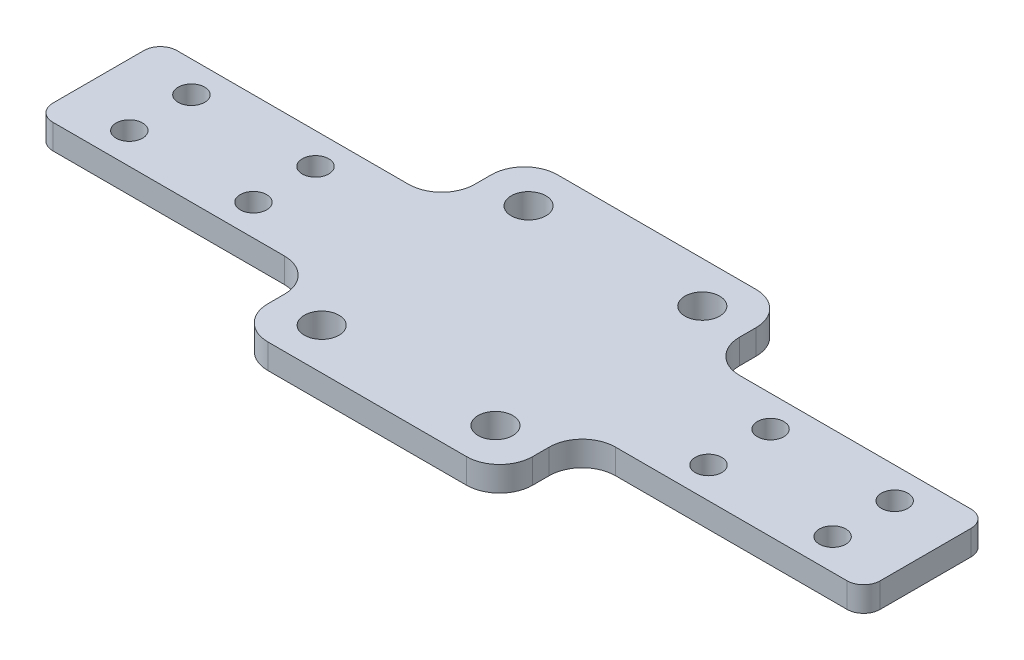
ISO-10303-21;
HEADER;
FILE_DESCRIPTION(('STEP AP214'),'2;1');
FILE_NAME('part.step','',(''),(''),'','','');
FILE_SCHEMA(('AUTOMOTIVE_DESIGN { 1 0 10303 214 1 1 1 1 }'));
ENDSEC;
DATA;
#1=APPLICATION_CONTEXT('core data for automotive mechanical design processes');
#2=APPLICATION_PROTOCOL_DEFINITION('international standard','automotive_design',2000,#1);
#3=PRODUCT_CONTEXT('',#1,'mechanical');
#4=PRODUCT('Part','Part','',(#3));
#5=PRODUCT_RELATED_PRODUCT_CATEGORY('part','',(#4));
#6=PRODUCT_DEFINITION_FORMATION('','',#4);
#7=PRODUCT_DEFINITION_CONTEXT('part definition',#1,'design');
#8=PRODUCT_DEFINITION('design','',#6,#7);
#9=PRODUCT_DEFINITION_SHAPE('','',#8);
#10=(LENGTH_UNIT() NAMED_UNIT(*) SI_UNIT(.MILLI.,.METRE.));
#11=(NAMED_UNIT(*) PLANE_ANGLE_UNIT() SI_UNIT($,.RADIAN.));
#12=(NAMED_UNIT(*) SI_UNIT($,.STERADIAN.) SOLID_ANGLE_UNIT());
#13=UNCERTAINTY_MEASURE_WITH_UNIT(LENGTH_MEASURE(1.E-05),#10,'distance_accuracy_value','');
#14=(GEOMETRIC_REPRESENTATION_CONTEXT(3) GLOBAL_UNCERTAINTY_ASSIGNED_CONTEXT((#13)) GLOBAL_UNIT_ASSIGNED_CONTEXT((#10,
#11,#12)) REPRESENTATION_CONTEXT('',''));
#15=CARTESIAN_POINT('',(0.,0.,0.));
#16=DIRECTION('',(0.,0.,1.));
#17=DIRECTION('',(1.,0.,0.));
#18=AXIS2_PLACEMENT_3D('',#15,#16,#17);
#19=CARTESIAN_POINT('',(-50.,3.,-7.5));
#20=DIRECTION('',(0.,0.,1.));
#21=DIRECTION('',(1.,0.,0.));
#22=AXIS2_PLACEMENT_3D('',#19,#20,#21);
#23=PLANE('',#22);
#24=DIRECTION('',(-1.,0.,0.));
#25=VECTOR('',#24,1.);
#26=CARTESIAN_POINT('',(-50.,0.,-7.5));
#27=LINE('',#26,#25);
#28=CARTESIAN_POINT('',(-20.,0.,-7.5));
#29=VERTEX_POINT('',#28);
#30=CARTESIAN_POINT('',(-48.,0.,-7.5));
#31=VERTEX_POINT('',#30);
#32=EDGE_CURVE('E323',#29,#31,#27,.T.);
#33=ORIENTED_EDGE('',*,*,#32,.T.);
#34=DIRECTION('',(0.,-1.,0.));
#35=VECTOR('',#34,1.);
#36=CARTESIAN_POINT('',(-48.,3.,-7.5));
#37=LINE('',#36,#35);
#38=CARTESIAN_POINT('',(-48.,3.,-7.5));
#39=VERTEX_POINT('',#38);
#40=EDGE_CURVE('E59',#31,#39,#37,.F.);
#41=ORIENTED_EDGE('',*,*,#40,.T.);
#42=DIRECTION('',(-1.,0.,0.));
#43=VECTOR('',#42,1.);
#44=CARTESIAN_POINT('',(-50.,3.,-7.5));
#45=LINE('',#44,#43);
#46=CARTESIAN_POINT('',(-20.,3.,-7.5));
#47=VERTEX_POINT('',#46);
#48=EDGE_CURVE('E435',#47,#39,#45,.T.);
#49=ORIENTED_EDGE('',*,*,#48,.F.);
#50=DIRECTION('',(0.,-1.,0.));
#51=VECTOR('',#50,1.);
#52=CARTESIAN_POINT('',(-20.,3.,-7.5));
#53=LINE('',#52,#51);
#54=EDGE_CURVE('E401',#47,#29,#53,.T.);
#55=ORIENTED_EDGE('',*,*,#54,.T.);
#56=EDGE_LOOP('',(#33,#41,#49,#55));
#57=FACE_BOUND('',#56,.T.);
#58=ADVANCED_FACE('F43',(#57),#23,.F.);
#59=CARTESIAN_POINT('',(-50.,3.,7.5));
#60=DIRECTION('',(0.,0.,-1.));
#61=DIRECTION('',(-1.,0.,0.));
#62=AXIS2_PLACEMENT_3D('',#59,#60,#61);
#63=PLANE('',#62);
#64=DIRECTION('',(1.,0.,0.));
#65=VECTOR('',#64,1.);
#66=CARTESIAN_POINT('',(-50.,3.,7.5));
#67=LINE('',#66,#65);
#68=CARTESIAN_POINT('',(-48.,3.,7.5));
#69=VERTEX_POINT('',#68);
#70=CARTESIAN_POINT('',(-20.,3.,7.5));
#71=VERTEX_POINT('',#70);
#72=EDGE_CURVE('E222',#69,#71,#67,.T.);
#73=ORIENTED_EDGE('',*,*,#72,.F.);
#74=DIRECTION('',(0.,-1.,0.));
#75=VECTOR('',#74,1.);
#76=CARTESIAN_POINT('',(-48.,3.,7.5));
#77=LINE('',#76,#75);
#78=CARTESIAN_POINT('',(-48.,0.,7.5));
#79=VERTEX_POINT('',#78);
#80=EDGE_CURVE('E241',#69,#79,#77,.T.);
#81=ORIENTED_EDGE('',*,*,#80,.T.);
#82=DIRECTION('',(1.,0.,0.));
#83=VECTOR('',#82,1.);
#84=CARTESIAN_POINT('',(-50.,0.,7.5));
#85=LINE('',#84,#83);
#86=CARTESIAN_POINT('',(-20.,0.,7.5));
#87=VERTEX_POINT('',#86);
#88=EDGE_CURVE('E340',#79,#87,#85,.T.);
#89=ORIENTED_EDGE('',*,*,#88,.T.);
#90=DIRECTION('',(0.,1.,0.));
#91=VECTOR('',#90,1.);
#92=CARTESIAN_POINT('',(-20.,3.,7.5));
#93=LINE('',#92,#91);
#94=EDGE_CURVE('E239',#87,#71,#93,.T.);
#95=ORIENTED_EDGE('',*,*,#94,.T.);
#96=EDGE_LOOP('',(#73,#81,#89,#95));
#97=FACE_BOUND('',#96,.T.);
#98=ADVANCED_FACE('F606',(#97),#63,.F.);
#99=CARTESIAN_POINT('',(50.,3.,7.5));
#100=DIRECTION('',(-1.,0.,0.));
#101=DIRECTION('',(0.,0.,1.));
#102=AXIS2_PLACEMENT_3D('',#99,#100,#101);
#103=PLANE('',#102);
#104=DIRECTION('',(0.,0.,-1.));
#105=VECTOR('',#104,1.);
#106=CARTESIAN_POINT('',(50.,3.,7.5));
#107=LINE('',#106,#105);
#108=CARTESIAN_POINT('',(50.,3.,5.5));
#109=VERTEX_POINT('',#108);
#110=CARTESIAN_POINT('',(50.,3.,-5.5));
#111=VERTEX_POINT('',#110);
#112=EDGE_CURVE('E320',#109,#111,#107,.T.);
#113=ORIENTED_EDGE('',*,*,#112,.F.);
#114=DIRECTION('',(0.,-1.,0.));
#115=VECTOR('',#114,1.);
#116=CARTESIAN_POINT('',(50.,3.,5.5));
#117=LINE('',#116,#115);
#118=CARTESIAN_POINT('',(50.,0.,5.5));
#119=VERTEX_POINT('',#118);
#120=EDGE_CURVE('E287',#109,#119,#117,.T.);
#121=ORIENTED_EDGE('',*,*,#120,.T.);
#122=DIRECTION('',(0.,0.,-1.));
#123=VECTOR('',#122,1.);
#124=CARTESIAN_POINT('',(50.,0.,7.5));
#125=LINE('',#124,#123);
#126=CARTESIAN_POINT('',(50.,0.,-5.5));
#127=VERTEX_POINT('',#126);
#128=EDGE_CURVE('E318',#119,#127,#125,.T.);
#129=ORIENTED_EDGE('',*,*,#128,.T.);
#130=DIRECTION('',(0.,-1.,0.));
#131=VECTOR('',#130,1.);
#132=CARTESIAN_POINT('',(50.,3.,-5.5));
#133=LINE('',#132,#131);
#134=EDGE_CURVE('E284',#127,#111,#133,.F.);
#135=ORIENTED_EDGE('',*,*,#134,.T.);
#136=EDGE_LOOP('',(#113,#121,#129,#135));
#137=FACE_BOUND('',#136,.T.);
#138=ADVANCED_FACE('F317',(#137),#103,.F.);
#139=CARTESIAN_POINT('',(48.,3.,-7.5));
#140=VERTEX_POINT('',#139);
#141=CARTESIAN_POINT('',(20.,3.,-7.5));
#142=VERTEX_POINT('',#141);
#143=EDGE_CURVE('E433',#140,#142,#45,.T.);
#144=ORIENTED_EDGE('',*,*,#143,.F.);
#145=DIRECTION('',(0.,-1.,0.));
#146=VECTOR('',#145,1.);
#147=CARTESIAN_POINT('',(48.,3.,-7.5));
#148=LINE('',#147,#146);
#149=CARTESIAN_POINT('',(48.,0.,-7.5));
#150=VERTEX_POINT('',#149);
#151=EDGE_CURVE('E11',#140,#150,#148,.T.);
#152=ORIENTED_EDGE('',*,*,#151,.T.);
#153=CARTESIAN_POINT('',(20.,0.,-7.5));
#154=VERTEX_POINT('',#153);
#155=EDGE_CURVE('E328',#150,#154,#27,.T.);
#156=ORIENTED_EDGE('',*,*,#155,.T.);
#157=DIRECTION('',(0.,1.,0.));
#158=VECTOR('',#157,1.);
#159=CARTESIAN_POINT('',(20.,3.,-7.5));
#160=LINE('',#159,#158);
#161=EDGE_CURVE('E405',#154,#142,#160,.T.);
#162=ORIENTED_EDGE('',*,*,#161,.T.);
#163=EDGE_LOOP('',(#144,#152,#156,#162));
#164=FACE_BOUND('',#163,.T.);
#165=ADVANCED_FACE('F608',(#164),#23,.F.);
#166=CARTESIAN_POINT('',(-50.,3.,7.5));
#167=DIRECTION('',(1.,0.,0.));
#168=DIRECTION('',(0.,0.,-1.));
#169=AXIS2_PLACEMENT_3D('',#166,#167,#168);
#170=PLANE('',#169);
#171=DIRECTION('',(0.,0.,1.));
#172=VECTOR('',#171,1.);
#173=CARTESIAN_POINT('',(-50.,0.,7.5));
#174=LINE('',#173,#172);
#175=CARTESIAN_POINT('',(-50.,0.,-5.5));
#176=VERTEX_POINT('',#175);
#177=CARTESIAN_POINT('',(-50.,0.,5.5));
#178=VERTEX_POINT('',#177);
#179=EDGE_CURVE('E336',#176,#178,#174,.T.);
#180=ORIENTED_EDGE('',*,*,#179,.T.);
#181=DIRECTION('',(0.,-1.,0.));
#182=VECTOR('',#181,1.);
#183=CARTESIAN_POINT('',(-50.,3.,5.5));
#184=LINE('',#183,#182);
#185=CARTESIAN_POINT('',(-50.,3.,5.5));
#186=VERTEX_POINT('',#185);
#187=EDGE_CURVE('E268',#178,#186,#184,.F.);
#188=ORIENTED_EDGE('',*,*,#187,.T.);
#189=DIRECTION('',(0.,0.,1.));
#190=VECTOR('',#189,1.);
#191=CARTESIAN_POINT('',(-50.,3.,7.5));
#192=LINE('',#191,#190);
#193=CARTESIAN_POINT('',(-50.,3.,-5.5));
#194=VERTEX_POINT('',#193);
#195=EDGE_CURVE('E310',#194,#186,#192,.T.);
#196=ORIENTED_EDGE('',*,*,#195,.F.);
#197=DIRECTION('',(0.,-1.,0.));
#198=VECTOR('',#197,1.);
#199=CARTESIAN_POINT('',(-50.,3.,-5.5));
#200=LINE('',#199,#198);
#201=EDGE_CURVE('E264',#194,#176,#200,.T.);
#202=ORIENTED_EDGE('',*,*,#201,.T.);
#203=EDGE_LOOP('',(#180,#188,#196,#202));
#204=FACE_BOUND('',#203,.T.);
#205=ADVANCED_FACE('F617',(#204),#170,.F.);
#206=CARTESIAN_POINT('',(20.,0.,7.5));
#207=VERTEX_POINT('',#206);
#208=CARTESIAN_POINT('',(48.,0.,7.5));
#209=VERTEX_POINT('',#208);
#210=EDGE_CURVE('E301',#207,#209,#85,.T.);
#211=ORIENTED_EDGE('',*,*,#210,.T.);
#212=DIRECTION('',(0.,-1.,0.));
#213=VECTOR('',#212,1.);
#214=CARTESIAN_POINT('',(48.,3.,7.5));
#215=LINE('',#214,#213);
#216=CARTESIAN_POINT('',(48.,3.,7.5));
#217=VERTEX_POINT('',#216);
#218=EDGE_CURVE('E52',#209,#217,#215,.F.);
#219=ORIENTED_EDGE('',*,*,#218,.T.);
#220=CARTESIAN_POINT('',(20.,3.,7.5));
#221=VERTEX_POINT('',#220);
#222=EDGE_CURVE('E298',#221,#217,#67,.T.);
#223=ORIENTED_EDGE('',*,*,#222,.F.);
#224=DIRECTION('',(0.,-1.,0.));
#225=VECTOR('',#224,1.);
#226=CARTESIAN_POINT('',(20.,3.,7.5));
#227=LINE('',#226,#225);
#228=EDGE_CURVE('E409',#221,#207,#227,.T.);
#229=ORIENTED_EDGE('',*,*,#228,.T.);
#230=EDGE_LOOP('',(#211,#219,#223,#229));
#231=FACE_BOUND('',#230,.T.);
#232=ADVANCED_FACE('F296',(#231),#63,.F.);
#233=CARTESIAN_POINT('',(0.,3.,0.));
#234=DIRECTION('',(0.,-1.,0.));
#235=DIRECTION('',(0.,0.,-1.));
#236=AXIS2_PLACEMENT_3D('',#233,#234,#235);
#237=PLANE('',#236);
#238=CARTESIAN_POINT('',(10.5,3.,-12.5));
#239=DIRECTION('',(0.,1.,0.));
#240=DIRECTION('',(0.,0.,-1.));
#241=AXIS2_PLACEMENT_3D('',#238,#239,#240);
#242=CIRCLE('',#241,2.1);
#243=CARTESIAN_POINT('',(10.5,3.,-14.6));
#244=VERTEX_POINT('',#243);
#245=EDGE_CURVE('E543',#244,#244,#242,.T.);
#246=ORIENTED_EDGE('',*,*,#245,.F.);
#247=EDGE_LOOP('',(#246));
#248=FACE_BOUND('',#247,.T.);
#249=CARTESIAN_POINT('',(10.5,3.,12.5));
#250=DIRECTION('',(0.,1.,0.));
#251=DIRECTION('',(0.,0.,1.));
#252=AXIS2_PLACEMENT_3D('',#249,#250,#251);
#253=CIRCLE('',#252,2.1);
#254=CARTESIAN_POINT('',(10.5,3.,14.6));
#255=VERTEX_POINT('',#254);
#256=EDGE_CURVE('E551',#255,#255,#253,.T.);
#257=ORIENTED_EDGE('',*,*,#256,.F.);
#258=EDGE_LOOP('',(#257));
#259=FACE_BOUND('',#258,.T.);
#260=CARTESIAN_POINT('',(-10.5,3.,12.5));
#261=DIRECTION('',(0.,1.,0.));
#262=DIRECTION('',(0.,0.,-1.));
#263=AXIS2_PLACEMENT_3D('',#260,#261,#262);
#264=CIRCLE('',#263,2.1);
#265=CARTESIAN_POINT('',(-10.5,3.,10.4));
#266=VERTEX_POINT('',#265);
#267=EDGE_CURVE('E535',#266,#266,#264,.T.);
#268=ORIENTED_EDGE('',*,*,#267,.F.);
#269=EDGE_LOOP('',(#268));
#270=FACE_BOUND('',#269,.T.);
#271=CARTESIAN_POINT('',(-10.5,3.,-12.5));
#272=DIRECTION('',(0.,1.,0.));
#273=DIRECTION('',(0.,0.,1.));
#274=AXIS2_PLACEMENT_3D('',#271,#272,#273);
#275=CIRCLE('',#274,2.1);
#276=CARTESIAN_POINT('',(-10.5,3.,-10.4));
#277=VERTEX_POINT('',#276);
#278=EDGE_CURVE('E531',#277,#277,#275,.T.);
#279=ORIENTED_EDGE('',*,*,#278,.F.);
#280=EDGE_LOOP('',(#279));
#281=FACE_BOUND('',#280,.T.);
#282=CARTESIAN_POINT('',(42.5,3.,3.75));
#283=DIRECTION('',(0.,1.,0.));
#284=DIRECTION('',(0.,0.,1.));
#285=AXIS2_PLACEMENT_3D('',#282,#283,#284);
#286=CIRCLE('',#285,1.6);
#287=CARTESIAN_POINT('',(42.5,3.,5.35));
#288=VERTEX_POINT('',#287);
#289=EDGE_CURVE('E495',#288,#288,#286,.T.);
#290=ORIENTED_EDGE('',*,*,#289,.F.);
#291=EDGE_LOOP('',(#290));
#292=FACE_BOUND('',#291,.T.);
#293=CARTESIAN_POINT('',(-27.5,3.,-3.75));
#294=DIRECTION('',(0.,1.,0.));
#295=DIRECTION('',(0.,0.,-1.));
#296=AXIS2_PLACEMENT_3D('',#293,#294,#295);
#297=CIRCLE('',#296,1.6);
#298=CARTESIAN_POINT('',(-27.5,3.,-5.35));
#299=VERTEX_POINT('',#298);
#300=EDGE_CURVE('E480',#299,#299,#297,.T.);
#301=ORIENTED_EDGE('',*,*,#300,.F.);
#302=EDGE_LOOP('',(#301));
#303=FACE_BOUND('',#302,.T.);
#304=CARTESIAN_POINT('',(-27.5,3.,3.75));
#305=DIRECTION('',(0.,1.,0.));
#306=DIRECTION('',(0.,0.,1.));
#307=AXIS2_PLACEMENT_3D('',#304,#305,#306);
#308=CIRCLE('',#307,1.6);
#309=CARTESIAN_POINT('',(-27.5,3.,5.35));
#310=VERTEX_POINT('',#309);
#311=EDGE_CURVE('E479',#310,#310,#308,.T.);
#312=ORIENTED_EDGE('',*,*,#311,.F.);
#313=EDGE_LOOP('',(#312));
#314=FACE_BOUND('',#313,.T.);
#315=CARTESIAN_POINT('',(-42.5,3.,3.75));
#316=DIRECTION('',(0.,1.,0.));
#317=DIRECTION('',(0.,0.,-1.));
#318=AXIS2_PLACEMENT_3D('',#315,#316,#317);
#319=CIRCLE('',#318,1.6);
#320=CARTESIAN_POINT('',(-42.5,3.,2.15));
#321=VERTEX_POINT('',#320);
#322=EDGE_CURVE('E471',#321,#321,#319,.T.);
#323=ORIENTED_EDGE('',*,*,#322,.F.);
#324=EDGE_LOOP('',(#323));
#325=FACE_BOUND('',#324,.T.);
#326=CARTESIAN_POINT('',(27.5,3.,-3.75));
#327=DIRECTION('',(0.,1.,0.));
#328=DIRECTION('',(0.,0.,1.));
#329=AXIS2_PLACEMENT_3D('',#326,#327,#328);
#330=CIRCLE('',#329,1.6);
#331=CARTESIAN_POINT('',(27.5,3.,-2.15));
#332=VERTEX_POINT('',#331);
#333=EDGE_CURVE('E512',#332,#332,#330,.T.);
#334=ORIENTED_EDGE('',*,*,#333,.F.);
#335=EDGE_LOOP('',(#334));
#336=FACE_BOUND('',#335,.T.);
#337=CARTESIAN_POINT('',(27.5,3.,3.75));
#338=DIRECTION('',(0.,1.,0.));
#339=DIRECTION('',(0.,0.,-1.));
#340=AXIS2_PLACEMENT_3D('',#337,#338,#339);
#341=CIRCLE('',#340,1.6);
#342=CARTESIAN_POINT('',(27.5,3.,2.15));
#343=VERTEX_POINT('',#342);
#344=EDGE_CURVE('E511',#343,#343,#341,.T.);
#345=ORIENTED_EDGE('',*,*,#344,.F.);
#346=EDGE_LOOP('',(#345));
#347=FACE_BOUND('',#346,.T.);
#348=CARTESIAN_POINT('',(42.5,3.,-3.75));
#349=DIRECTION('',(0.,1.,0.));
#350=DIRECTION('',(0.,0.,-1.));
#351=AXIS2_PLACEMENT_3D('',#348,#349,#350);
#352=CIRCLE('',#351,1.6);
#353=CARTESIAN_POINT('',(42.5,3.,-5.35));
#354=VERTEX_POINT('',#353);
#355=EDGE_CURVE('E496',#354,#354,#352,.T.);
#356=ORIENTED_EDGE('',*,*,#355,.F.);
#357=EDGE_LOOP('',(#356));
#358=FACE_BOUND('',#357,.T.);
#359=CARTESIAN_POINT('',(-42.5,3.,-3.75));
#360=DIRECTION('',(0.,1.,0.));
#361=DIRECTION('',(0.,0.,1.));
#362=AXIS2_PLACEMENT_3D('',#359,#360,#361);
#363=CIRCLE('',#362,1.6);
#364=CARTESIAN_POINT('',(-42.5,3.,-2.15));
#365=VERTEX_POINT('',#364);
#366=EDGE_CURVE('E466',#365,#365,#363,.T.);
#367=ORIENTED_EDGE('',*,*,#366,.F.);
#368=EDGE_LOOP('',(#367));
#369=FACE_BOUND('',#368,.T.);
#370=ORIENTED_EDGE('',*,*,#195,.T.);
#371=CARTESIAN_POINT('',(-48.,3.,5.5));
#372=DIRECTION('',(0.,-1.,0.));
#373=DIRECTION('',(0.,0.,-1.));
#374=AXIS2_PLACEMENT_3D('',#371,#372,#373);
#375=CIRCLE('',#374,2.);
#376=EDGE_CURVE('E279',#186,#69,#375,.F.);
#377=ORIENTED_EDGE('',*,*,#376,.T.);
#378=ORIENTED_EDGE('',*,*,#72,.T.);
#379=CARTESIAN_POINT('',(-20.,3.,11.5));
#380=DIRECTION('',(0.,-1.,0.));
#381=DIRECTION('',(0.,0.,-1.));
#382=AXIS2_PLACEMENT_3D('',#379,#380,#381);
#383=CIRCLE('',#382,4.);
#384=CARTESIAN_POINT('',(-16.,3.,11.5));
#385=VERTEX_POINT('',#384);
#386=EDGE_CURVE('E242',#71,#385,#383,.T.);
#387=ORIENTED_EDGE('',*,*,#386,.T.);
#388=DIRECTION('',(0.,0.,1.));
#389=VECTOR('',#388,1.);
#390=CARTESIAN_POINT('',(-16.,3.,-17.5));
#391=LINE('',#390,#389);
#392=CARTESIAN_POINT('',(-16.,3.,13.5));
#393=VERTEX_POINT('',#392);
#394=EDGE_CURVE('E216',#385,#393,#391,.T.);
#395=ORIENTED_EDGE('',*,*,#394,.T.);
#396=CARTESIAN_POINT('',(-12.,3.,13.5));
#397=DIRECTION('',(0.,-1.,0.));
#398=DIRECTION('',(0.,0.,-1.));
#399=AXIS2_PLACEMENT_3D('',#396,#397,#398);
#400=CIRCLE('',#399,4.);
#401=CARTESIAN_POINT('',(-12.,3.,17.5));
#402=VERTEX_POINT('',#401);
#403=EDGE_CURVE('E354',#393,#402,#400,.F.);
#404=ORIENTED_EDGE('',*,*,#403,.T.);
#405=DIRECTION('',(1.,0.,0.));
#406=VECTOR('',#405,1.);
#407=CARTESIAN_POINT('',(-16.,3.,17.5));
#408=LINE('',#407,#406);
#409=CARTESIAN_POINT('',(12.,3.,17.5));
#410=VERTEX_POINT('',#409);
#411=EDGE_CURVE('E448',#402,#410,#408,.T.);
#412=ORIENTED_EDGE('',*,*,#411,.T.);
#413=CARTESIAN_POINT('',(12.,3.,13.5));
#414=DIRECTION('',(0.,-1.,0.));
#415=DIRECTION('',(0.,0.,-1.));
#416=AXIS2_PLACEMENT_3D('',#413,#414,#415);
#417=CIRCLE('',#416,4.);
#418=CARTESIAN_POINT('',(16.,3.,13.5));
#419=VERTEX_POINT('',#418);
#420=EDGE_CURVE('E351',#410,#419,#417,.F.);
#421=ORIENTED_EDGE('',*,*,#420,.T.);
#422=DIRECTION('',(0.,0.,-1.));
#423=VECTOR('',#422,1.);
#424=CARTESIAN_POINT('',(16.,3.,-17.5));
#425=LINE('',#424,#423);
#426=CARTESIAN_POINT('',(16.,3.,11.5));
#427=VERTEX_POINT('',#426);
#428=EDGE_CURVE('E444',#419,#427,#425,.T.);
#429=ORIENTED_EDGE('',*,*,#428,.T.);
#430=CARTESIAN_POINT('',(20.,3.,11.5));
#431=DIRECTION('',(0.,-1.,0.));
#432=DIRECTION('',(0.,0.,-1.));
#433=AXIS2_PLACEMENT_3D('',#430,#431,#432);
#434=CIRCLE('',#433,4.);
#435=EDGE_CURVE('E249',#427,#221,#434,.T.);
#436=ORIENTED_EDGE('',*,*,#435,.T.);
#437=ORIENTED_EDGE('',*,*,#222,.T.);
#438=CARTESIAN_POINT('',(48.,3.,5.5));
#439=DIRECTION('',(0.,-1.,0.));
#440=DIRECTION('',(0.,0.,-1.));
#441=AXIS2_PLACEMENT_3D('',#438,#439,#440);
#442=CIRCLE('',#441,2.);
#443=EDGE_CURVE('E273',#217,#109,#442,.F.);
#444=ORIENTED_EDGE('',*,*,#443,.T.);
#445=ORIENTED_EDGE('',*,*,#112,.T.);
#446=CARTESIAN_POINT('',(48.,3.,-5.5));
#447=DIRECTION('',(0.,-1.,0.));
#448=DIRECTION('',(0.,0.,-1.));
#449=AXIS2_PLACEMENT_3D('',#446,#447,#448);
#450=CIRCLE('',#449,2.);
#451=EDGE_CURVE('E67',#111,#140,#450,.F.);
#452=ORIENTED_EDGE('',*,*,#451,.T.);
#453=ORIENTED_EDGE('',*,*,#143,.T.);
#454=CARTESIAN_POINT('',(20.,3.,-11.5));
#455=DIRECTION('',(0.,-1.,0.));
#456=DIRECTION('',(0.,0.,-1.));
#457=AXIS2_PLACEMENT_3D('',#454,#455,#456);
#458=CIRCLE('',#457,4.);
#459=CARTESIAN_POINT('',(16.,3.,-11.5));
#460=VERTEX_POINT('',#459);
#461=EDGE_CURVE('E420',#142,#460,#458,.T.);
#462=ORIENTED_EDGE('',*,*,#461,.T.);
#463=CARTESIAN_POINT('',(16.,3.,-13.5));
#464=VERTEX_POINT('',#463);
#465=EDGE_CURVE('E447',#460,#464,#425,.T.);
#466=ORIENTED_EDGE('',*,*,#465,.T.);
#467=CARTESIAN_POINT('',(12.,3.,-13.5));
#468=DIRECTION('',(0.,-1.,0.));
#469=DIRECTION('',(0.,0.,-1.));
#470=AXIS2_PLACEMENT_3D('',#467,#468,#469);
#471=CIRCLE('',#470,4.);
#472=CARTESIAN_POINT('',(12.,3.,-17.5));
#473=VERTEX_POINT('',#472);
#474=EDGE_CURVE('E348',#464,#473,#471,.F.);
#475=ORIENTED_EDGE('',*,*,#474,.T.);
#476=DIRECTION('',(-1.,0.,0.));
#477=VECTOR('',#476,1.);
#478=CARTESIAN_POINT('',(-16.,3.,-17.5));
#479=LINE('',#478,#477);
#480=CARTESIAN_POINT('',(-12.,3.,-17.5));
#481=VERTEX_POINT('',#480);
#482=EDGE_CURVE('E235',#473,#481,#479,.T.);
#483=ORIENTED_EDGE('',*,*,#482,.T.);
#484=CARTESIAN_POINT('',(-12.,3.,-13.5));
#485=DIRECTION('',(0.,-1.,0.));
#486=DIRECTION('',(0.,0.,-1.));
#487=AXIS2_PLACEMENT_3D('',#484,#485,#486);
#488=CIRCLE('',#487,4.);
#489=CARTESIAN_POINT('',(-16.,3.,-13.5));
#490=VERTEX_POINT('',#489);
#491=EDGE_CURVE('E345',#481,#490,#488,.F.);
#492=ORIENTED_EDGE('',*,*,#491,.T.);
#493=CARTESIAN_POINT('',(-16.,3.,-11.5));
#494=VERTEX_POINT('',#493);
#495=EDGE_CURVE('E452',#490,#494,#391,.T.);
#496=ORIENTED_EDGE('',*,*,#495,.T.);
#497=CARTESIAN_POINT('',(-20.,3.,-11.5));
#498=DIRECTION('',(0.,-1.,0.));
#499=DIRECTION('',(0.,0.,-1.));
#500=AXIS2_PLACEMENT_3D('',#497,#498,#499);
#501=CIRCLE('',#500,4.);
#502=EDGE_CURVE('E417',#494,#47,#501,.T.);
#503=ORIENTED_EDGE('',*,*,#502,.T.);
#504=ORIENTED_EDGE('',*,*,#48,.T.);
#505=CARTESIAN_POINT('',(-48.,3.,-5.5));
#506=DIRECTION('',(0.,-1.,0.));
#507=DIRECTION('',(0.,0.,-1.));
#508=AXIS2_PLACEMENT_3D('',#505,#506,#507);
#509=CIRCLE('',#508,2.);
#510=EDGE_CURVE('E276',#39,#194,#509,.F.);
#511=ORIENTED_EDGE('',*,*,#510,.T.);
#512=EDGE_LOOP('',(#370,#377,#378,#387,#395,#404,#412,#421,#429,#436,#437,#444,#445,#452,#453,
#462,#466,#475,#483,#492,#496,#503,#504,#511));
#513=FACE_BOUND('',#512,.T.);
#514=ADVANCED_FACE('F305',(#248,#259,#270,#281,#292,#303,#314,#325,#336,#347,#358,#369,#513),
#237,.F.);
#515=CARTESIAN_POINT('',(0.,0.,0.));
#516=DIRECTION('',(0.,-1.,0.));
#517=DIRECTION('',(0.,0.,-1.));
#518=AXIS2_PLACEMENT_3D('',#515,#516,#517);
#519=PLANE('',#518);
#520=CARTESIAN_POINT('',(10.5,0.,-12.5));
#521=DIRECTION('',(0.,1.,0.));
#522=DIRECTION('',(0.,0.,-1.));
#523=AXIS2_PLACEMENT_3D('',#520,#521,#522);
#524=CIRCLE('',#523,2.1);
#525=CARTESIAN_POINT('',(10.5,0.,-14.6));
#526=VERTEX_POINT('',#525);
#527=EDGE_CURVE('E539',#526,#526,#524,.T.);
#528=ORIENTED_EDGE('',*,*,#527,.T.);
#529=EDGE_LOOP('',(#528));
#530=FACE_BOUND('',#529,.T.);
#531=CARTESIAN_POINT('',(10.5,0.,12.5));
#532=DIRECTION('',(0.,1.,0.));
#533=DIRECTION('',(0.,0.,1.));
#534=AXIS2_PLACEMENT_3D('',#531,#532,#533);
#535=CIRCLE('',#534,2.1);
#536=CARTESIAN_POINT('',(10.5,0.,14.6));
#537=VERTEX_POINT('',#536);
#538=EDGE_CURVE('E547',#537,#537,#535,.T.);
#539=ORIENTED_EDGE('',*,*,#538,.T.);
#540=EDGE_LOOP('',(#539));
#541=FACE_BOUND('',#540,.T.);
#542=CARTESIAN_POINT('',(-10.5,0.,12.5));
#543=DIRECTION('',(0.,1.,0.));
#544=DIRECTION('',(0.,0.,-1.));
#545=AXIS2_PLACEMENT_3D('',#542,#543,#544);
#546=CIRCLE('',#545,2.1);
#547=CARTESIAN_POINT('',(-10.5,0.,10.4));
#548=VERTEX_POINT('',#547);
#549=EDGE_CURVE('E555',#548,#548,#546,.T.);
#550=ORIENTED_EDGE('',*,*,#549,.T.);
#551=EDGE_LOOP('',(#550));
#552=FACE_BOUND('',#551,.T.);
#553=CARTESIAN_POINT('',(-10.5,0.,-12.5));
#554=DIRECTION('',(0.,1.,0.));
#555=DIRECTION('',(0.,0.,1.));
#556=AXIS2_PLACEMENT_3D('',#553,#554,#555);
#557=CIRCLE('',#556,2.1);
#558=CARTESIAN_POINT('',(-10.5,0.,-10.4));
#559=VERTEX_POINT('',#558);
#560=EDGE_CURVE('E527',#559,#559,#557,.T.);
#561=ORIENTED_EDGE('',*,*,#560,.T.);
#562=EDGE_LOOP('',(#561));
#563=FACE_BOUND('',#562,.T.);
#564=CARTESIAN_POINT('',(42.5,0.,3.75));
#565=DIRECTION('',(0.,1.,0.));
#566=DIRECTION('',(0.,0.,1.));
#567=AXIS2_PLACEMENT_3D('',#564,#565,#566);
#568=CIRCLE('',#567,1.6);
#569=CARTESIAN_POINT('',(42.5,0.,5.35));
#570=VERTEX_POINT('',#569);
#571=EDGE_CURVE('E491',#570,#570,#568,.T.);
#572=ORIENTED_EDGE('',*,*,#571,.T.);
#573=EDGE_LOOP('',(#572));
#574=FACE_BOUND('',#573,.T.);
#575=CARTESIAN_POINT('',(-27.5,0.,-3.75));
#576=DIRECTION('',(0.,1.,0.));
#577=DIRECTION('',(0.,0.,-1.));
#578=AXIS2_PLACEMENT_3D('',#575,#576,#577);
#579=CIRCLE('',#578,1.6);
#580=CARTESIAN_POINT('',(-27.5,0.,-5.35));
#581=VERTEX_POINT('',#580);
#582=EDGE_CURVE('E500',#581,#581,#579,.T.);
#583=ORIENTED_EDGE('',*,*,#582,.T.);
#584=EDGE_LOOP('',(#583));
#585=FACE_BOUND('',#584,.T.);
#586=CARTESIAN_POINT('',(-27.5,0.,3.75));
#587=DIRECTION('',(0.,1.,0.));
#588=DIRECTION('',(0.,0.,1.));
#589=AXIS2_PLACEMENT_3D('',#586,#587,#588);
#590=CIRCLE('',#589,1.6);
#591=CARTESIAN_POINT('',(-27.5,0.,5.35));
#592=VERTEX_POINT('',#591);
#593=EDGE_CURVE('E475',#592,#592,#590,.T.);
#594=ORIENTED_EDGE('',*,*,#593,.T.);
#595=EDGE_LOOP('',(#594));
#596=FACE_BOUND('',#595,.T.);
#597=CARTESIAN_POINT('',(-42.5,0.,3.75));
#598=DIRECTION('',(0.,1.,0.));
#599=DIRECTION('',(0.,0.,-1.));
#600=AXIS2_PLACEMENT_3D('',#597,#598,#599);
#601=CIRCLE('',#600,1.6);
#602=CARTESIAN_POINT('',(-42.5,0.,2.15));
#603=VERTEX_POINT('',#602);
#604=EDGE_CURVE('E484',#603,#603,#601,.T.);
#605=ORIENTED_EDGE('',*,*,#604,.T.);
#606=EDGE_LOOP('',(#605));
#607=FACE_BOUND('',#606,.T.);
#608=CARTESIAN_POINT('',(27.5,0.,-3.75));
#609=DIRECTION('',(0.,1.,0.));
#610=DIRECTION('',(0.,0.,1.));
#611=AXIS2_PLACEMENT_3D('',#608,#609,#610);
#612=CIRCLE('',#611,1.6);
#613=CARTESIAN_POINT('',(27.5,0.,-2.15));
#614=VERTEX_POINT('',#613);
#615=EDGE_CURVE('E523',#614,#614,#612,.T.);
#616=ORIENTED_EDGE('',*,*,#615,.T.);
#617=EDGE_LOOP('',(#616));
#618=FACE_BOUND('',#617,.T.);
#619=CARTESIAN_POINT('',(27.5,0.,3.75));
#620=DIRECTION('',(0.,1.,0.));
#621=DIRECTION('',(0.,0.,-1.));
#622=AXIS2_PLACEMENT_3D('',#619,#620,#621);
#623=CIRCLE('',#622,1.6);
#624=CARTESIAN_POINT('',(27.5,0.,2.15));
#625=VERTEX_POINT('',#624);
#626=EDGE_CURVE('E507',#625,#625,#623,.T.);
#627=ORIENTED_EDGE('',*,*,#626,.T.);
#628=EDGE_LOOP('',(#627));
#629=FACE_BOUND('',#628,.T.);
#630=CARTESIAN_POINT('',(42.5,0.,-3.75));
#631=DIRECTION('',(0.,1.,0.));
#632=DIRECTION('',(0.,0.,-1.));
#633=AXIS2_PLACEMENT_3D('',#630,#631,#632);
#634=CIRCLE('',#633,1.6);
#635=CARTESIAN_POINT('',(42.5,0.,-5.35));
#636=VERTEX_POINT('',#635);
#637=EDGE_CURVE('E516',#636,#636,#634,.T.);
#638=ORIENTED_EDGE('',*,*,#637,.T.);
#639=EDGE_LOOP('',(#638));
#640=FACE_BOUND('',#639,.T.);
#641=CARTESIAN_POINT('',(-42.5,0.,-3.75));
#642=DIRECTION('',(0.,1.,0.));
#643=DIRECTION('',(0.,0.,1.));
#644=AXIS2_PLACEMENT_3D('',#641,#642,#643);
#645=CIRCLE('',#644,1.6);
#646=CARTESIAN_POINT('',(-42.5,0.,-2.15));
#647=VERTEX_POINT('',#646);
#648=EDGE_CURVE('E470',#647,#647,#645,.T.);
#649=ORIENTED_EDGE('',*,*,#648,.T.);
#650=EDGE_LOOP('',(#649));
#651=FACE_BOUND('',#650,.T.);
#652=ORIENTED_EDGE('',*,*,#88,.F.);
#653=CARTESIAN_POINT('',(-48.,0.,5.5));
#654=DIRECTION('',(0.,-1.,0.));
#655=DIRECTION('',(0.,0.,-1.));
#656=AXIS2_PLACEMENT_3D('',#653,#654,#655);
#657=CIRCLE('',#656,2.);
#658=EDGE_CURVE('E261',#79,#178,#657,.T.);
#659=ORIENTED_EDGE('',*,*,#658,.T.);
#660=ORIENTED_EDGE('',*,*,#179,.F.);
#661=CARTESIAN_POINT('',(-48.,0.,-5.5));
#662=DIRECTION('',(0.,-1.,0.));
#663=DIRECTION('',(0.,0.,-1.));
#664=AXIS2_PLACEMENT_3D('',#661,#662,#663);
#665=CIRCLE('',#664,2.);
#666=EDGE_CURVE('E258',#176,#31,#665,.T.);
#667=ORIENTED_EDGE('',*,*,#666,.T.);
#668=ORIENTED_EDGE('',*,*,#32,.F.);
#669=CARTESIAN_POINT('',(-20.,0.,-11.5));
#670=DIRECTION('',(0.,-1.,0.));
#671=DIRECTION('',(0.,0.,-1.));
#672=AXIS2_PLACEMENT_3D('',#669,#670,#671);
#673=CIRCLE('',#672,4.);
#674=CARTESIAN_POINT('',(-16.,0.,-11.5));
#675=VERTEX_POINT('',#674);
#676=EDGE_CURVE('E414',#29,#675,#673,.F.);
#677=ORIENTED_EDGE('',*,*,#676,.T.);
#678=DIRECTION('',(0.,0.,1.));
#679=VECTOR('',#678,1.);
#680=CARTESIAN_POINT('',(-16.,0.,-17.5));
#681=LINE('',#680,#679);
#682=CARTESIAN_POINT('',(-16.,0.,-13.5));
#683=VERTEX_POINT('',#682);
#684=EDGE_CURVE('E234',#683,#675,#681,.T.);
#685=ORIENTED_EDGE('',*,*,#684,.F.);
#686=CARTESIAN_POINT('',(-12.,0.,-13.5));
#687=DIRECTION('',(0.,-1.,0.));
#688=DIRECTION('',(0.,0.,-1.));
#689=AXIS2_PLACEMENT_3D('',#686,#687,#688);
#690=CIRCLE('',#689,4.);
#691=CARTESIAN_POINT('',(-12.,0.,-17.5));
#692=VERTEX_POINT('',#691);
#693=EDGE_CURVE('E364',#683,#692,#690,.T.);
#694=ORIENTED_EDGE('',*,*,#693,.T.);
#695=DIRECTION('',(-1.,0.,0.));
#696=VECTOR('',#695,1.);
#697=CARTESIAN_POINT('',(-16.,0.,-17.5));
#698=LINE('',#697,#696);
#699=CARTESIAN_POINT('',(12.,0.,-17.5));
#700=VERTEX_POINT('',#699);
#701=EDGE_CURVE('E324',#700,#692,#698,.T.);
#702=ORIENTED_EDGE('',*,*,#701,.F.);
#703=CARTESIAN_POINT('',(12.,0.,-13.5));
#704=DIRECTION('',(0.,-1.,0.));
#705=DIRECTION('',(0.,0.,-1.));
#706=AXIS2_PLACEMENT_3D('',#703,#704,#705);
#707=CIRCLE('',#706,4.);
#708=CARTESIAN_POINT('',(16.,0.,-13.5));
#709=VERTEX_POINT('',#708);
#710=EDGE_CURVE('E367',#700,#709,#707,.T.);
#711=ORIENTED_EDGE('',*,*,#710,.T.);
#712=DIRECTION('',(0.,0.,-1.));
#713=VECTOR('',#712,1.);
#714=CARTESIAN_POINT('',(16.,0.,-17.5));
#715=LINE('',#714,#713);
#716=CARTESIAN_POINT('',(16.,0.,-11.5));
#717=VERTEX_POINT('',#716);
#718=EDGE_CURVE('E456',#717,#709,#715,.T.);
#719=ORIENTED_EDGE('',*,*,#718,.F.);
#720=CARTESIAN_POINT('',(20.,0.,-11.5));
#721=DIRECTION('',(0.,-1.,0.));
#722=DIRECTION('',(0.,0.,-1.));
#723=AXIS2_PLACEMENT_3D('',#720,#721,#722);
#724=CIRCLE('',#723,4.);
#725=EDGE_CURVE('E423',#717,#154,#724,.F.);
#726=ORIENTED_EDGE('',*,*,#725,.T.);
#727=ORIENTED_EDGE('',*,*,#155,.F.);
#728=CARTESIAN_POINT('',(48.,0.,-5.5));
#729=DIRECTION('',(0.,-1.,0.));
#730=DIRECTION('',(0.,0.,-1.));
#731=AXIS2_PLACEMENT_3D('',#728,#729,#730);
#732=CIRCLE('',#731,2.);
#733=EDGE_CURVE('E247',#150,#127,#732,.T.);
#734=ORIENTED_EDGE('',*,*,#733,.T.);
#735=ORIENTED_EDGE('',*,*,#128,.F.);
#736=CARTESIAN_POINT('',(48.,0.,5.5));
#737=DIRECTION('',(0.,-1.,0.));
#738=DIRECTION('',(0.,0.,-1.));
#739=AXIS2_PLACEMENT_3D('',#736,#737,#738);
#740=CIRCLE('',#739,2.);
#741=EDGE_CURVE('E255',#119,#209,#740,.T.);
#742=ORIENTED_EDGE('',*,*,#741,.T.);
#743=ORIENTED_EDGE('',*,*,#210,.F.);
#744=CARTESIAN_POINT('',(20.,0.,11.5));
#745=DIRECTION('',(0.,-1.,0.));
#746=DIRECTION('',(0.,0.,-1.));
#747=AXIS2_PLACEMENT_3D('',#744,#745,#746);
#748=CIRCLE('',#747,4.);
#749=CARTESIAN_POINT('',(16.,0.,11.5));
#750=VERTEX_POINT('',#749);
#751=EDGE_CURVE('E427',#207,#750,#748,.F.);
#752=ORIENTED_EDGE('',*,*,#751,.T.);
#753=CARTESIAN_POINT('',(16.,0.,13.5));
#754=VERTEX_POINT('',#753);
#755=EDGE_CURVE('E331',#754,#750,#715,.T.);
#756=ORIENTED_EDGE('',*,*,#755,.F.);
#757=CARTESIAN_POINT('',(12.,0.,13.5));
#758=DIRECTION('',(0.,-1.,0.));
#759=DIRECTION('',(0.,0.,-1.));
#760=AXIS2_PLACEMENT_3D('',#757,#758,#759);
#761=CIRCLE('',#760,4.);
#762=CARTESIAN_POINT('',(12.,0.,17.5));
#763=VERTEX_POINT('',#762);
#764=EDGE_CURVE('E370',#754,#763,#761,.T.);
#765=ORIENTED_EDGE('',*,*,#764,.T.);
#766=DIRECTION('',(1.,0.,0.));
#767=VECTOR('',#766,1.);
#768=CARTESIAN_POINT('',(-16.,0.,17.5));
#769=LINE('',#768,#767);
#770=CARTESIAN_POINT('',(-12.,0.,17.5));
#771=VERTEX_POINT('',#770);
#772=EDGE_CURVE('E460',#771,#763,#769,.T.);
#773=ORIENTED_EDGE('',*,*,#772,.F.);
#774=CARTESIAN_POINT('',(-12.,0.,13.5));
#775=DIRECTION('',(0.,-1.,0.));
#776=DIRECTION('',(0.,0.,-1.));
#777=AXIS2_PLACEMENT_3D('',#774,#775,#776);
#778=CIRCLE('',#777,4.);
#779=CARTESIAN_POINT('',(-16.,0.,13.5));
#780=VERTEX_POINT('',#779);
#781=EDGE_CURVE('E232',#771,#780,#778,.T.);
#782=ORIENTED_EDGE('',*,*,#781,.T.);
#783=CARTESIAN_POINT('',(-16.,0.,11.5));
#784=VERTEX_POINT('',#783);
#785=EDGE_CURVE('E213',#784,#780,#681,.T.);
#786=ORIENTED_EDGE('',*,*,#785,.F.);
#787=CARTESIAN_POINT('',(-20.,0.,11.5));
#788=DIRECTION('',(0.,-1.,0.));
#789=DIRECTION('',(0.,0.,-1.));
#790=AXIS2_PLACEMENT_3D('',#787,#788,#789);
#791=CIRCLE('',#790,4.);
#792=EDGE_CURVE('E228',#784,#87,#791,.F.);
#793=ORIENTED_EDGE('',*,*,#792,.T.);
#794=EDGE_LOOP('',(#652,#659,#660,#667,#668,#677,#685,#694,#702,#711,#719,#726,#727,#734,#735,
#742,#743,#752,#756,#765,#773,#782,#786,#793));
#795=FACE_BOUND('',#794,.T.);
#796=ADVANCED_FACE('F227',(#530,#541,#552,#563,#574,#585,#596,#607,#618,#629,#640,#651,#795),
#519,.T.);
#797=CARTESIAN_POINT('',(-16.,0.,17.5));
#798=DIRECTION('',(0.,0.,1.));
#799=DIRECTION('',(1.,0.,0.));
#800=AXIS2_PLACEMENT_3D('',#797,#798,#799);
#801=PLANE('',#800);
#802=ORIENTED_EDGE('',*,*,#411,.F.);
#803=DIRECTION('',(0.,1.,0.));
#804=VECTOR('',#803,1.);
#805=CARTESIAN_POINT('',(-12.,0.,17.5));
#806=LINE('',#805,#804);
#807=EDGE_CURVE('E361',#402,#771,#806,.F.);
#808=ORIENTED_EDGE('',*,*,#807,.T.);
#809=ORIENTED_EDGE('',*,*,#772,.T.);
#810=DIRECTION('',(0.,1.,0.));
#811=VECTOR('',#810,1.);
#812=CARTESIAN_POINT('',(12.,0.,17.5));
#813=LINE('',#812,#811);
#814=EDGE_CURVE('E357',#763,#410,#813,.T.);
#815=ORIENTED_EDGE('',*,*,#814,.T.);
#816=EDGE_LOOP('',(#802,#808,#809,#815));
#817=FACE_BOUND('',#816,.T.);
#818=ADVANCED_FACE('F695',(#817),#801,.T.);
#819=CARTESIAN_POINT('',(16.,0.,-17.5));
#820=DIRECTION('',(1.,0.,0.));
#821=DIRECTION('',(0.,0.,-1.));
#822=AXIS2_PLACEMENT_3D('',#819,#820,#821);
#823=PLANE('',#822);
#824=ORIENTED_EDGE('',*,*,#428,.F.);
#825=DIRECTION('',(0.,1.,0.));
#826=VECTOR('',#825,1.);
#827=CARTESIAN_POINT('',(16.,0.,13.5));
#828=LINE('',#827,#826);
#829=EDGE_CURVE('E378',#419,#754,#828,.F.);
#830=ORIENTED_EDGE('',*,*,#829,.T.);
#831=ORIENTED_EDGE('',*,*,#755,.T.);
#832=DIRECTION('',(0.,-1.,0.));
#833=VECTOR('',#832,1.);
#834=CARTESIAN_POINT('',(16.,0.,11.5));
#835=LINE('',#834,#833);
#836=EDGE_CURVE('E375',#750,#427,#835,.F.);
#837=ORIENTED_EDGE('',*,*,#836,.T.);
#838=EDGE_LOOP('',(#824,#830,#831,#837));
#839=FACE_BOUND('',#838,.T.);
#840=ADVANCED_FACE('F690',(#839),#823,.T.);
#841=CARTESIAN_POINT('',(-16.,0.,-17.5));
#842=DIRECTION('',(-1.,0.,0.));
#843=DIRECTION('',(0.,0.,1.));
#844=AXIS2_PLACEMENT_3D('',#841,#842,#843);
#845=PLANE('',#844);
#846=ORIENTED_EDGE('',*,*,#785,.T.);
#847=DIRECTION('',(0.,1.,0.));
#848=VECTOR('',#847,1.);
#849=CARTESIAN_POINT('',(-16.,0.,13.5));
#850=LINE('',#849,#848);
#851=EDGE_CURVE('E221',#780,#393,#850,.T.);
#852=ORIENTED_EDGE('',*,*,#851,.T.);
#853=ORIENTED_EDGE('',*,*,#394,.F.);
#854=DIRECTION('',(0.,1.,0.));
#855=VECTOR('',#854,1.);
#856=CARTESIAN_POINT('',(-16.,0.,11.5));
#857=LINE('',#856,#855);
#858=EDGE_CURVE('E209',#385,#784,#857,.F.);
#859=ORIENTED_EDGE('',*,*,#858,.T.);
#860=EDGE_LOOP('',(#846,#852,#853,#859));
#861=FACE_BOUND('',#860,.T.);
#862=ADVANCED_FACE('F211',(#861),#845,.T.);
#863=ORIENTED_EDGE('',*,*,#495,.F.);
#864=DIRECTION('',(0.,1.,0.));
#865=VECTOR('',#864,1.);
#866=CARTESIAN_POINT('',(-16.,0.,-13.5));
#867=LINE('',#866,#865);
#868=EDGE_CURVE('E398',#490,#683,#867,.F.);
#869=ORIENTED_EDGE('',*,*,#868,.T.);
#870=ORIENTED_EDGE('',*,*,#684,.T.);
#871=DIRECTION('',(0.,-1.,0.));
#872=VECTOR('',#871,1.);
#873=CARTESIAN_POINT('',(-16.,0.,-11.5));
#874=LINE('',#873,#872);
#875=EDGE_CURVE('E395',#675,#494,#874,.F.);
#876=ORIENTED_EDGE('',*,*,#875,.T.);
#877=EDGE_LOOP('',(#863,#869,#870,#876));
#878=FACE_BOUND('',#877,.T.);
#879=ADVANCED_FACE('F706',(#878),#845,.T.);
#880=ORIENTED_EDGE('',*,*,#718,.T.);
#881=DIRECTION('',(0.,1.,0.));
#882=VECTOR('',#881,1.);
#883=CARTESIAN_POINT('',(16.,0.,-13.5));
#884=LINE('',#883,#882);
#885=EDGE_CURVE('E384',#709,#464,#884,.T.);
#886=ORIENTED_EDGE('',*,*,#885,.T.);
#887=ORIENTED_EDGE('',*,*,#465,.F.);
#888=DIRECTION('',(0.,1.,0.));
#889=VECTOR('',#888,1.);
#890=CARTESIAN_POINT('',(16.,0.,-11.5));
#891=LINE('',#890,#889);
#892=EDGE_CURVE('E381',#460,#717,#891,.F.);
#893=ORIENTED_EDGE('',*,*,#892,.T.);
#894=EDGE_LOOP('',(#880,#886,#887,#893));
#895=FACE_BOUND('',#894,.T.);
#896=ADVANCED_FACE('F600',(#895),#823,.T.);
#897=CARTESIAN_POINT('',(-16.,0.,-17.5));
#898=DIRECTION('',(0.,0.,-1.));
#899=DIRECTION('',(-1.,0.,0.));
#900=AXIS2_PLACEMENT_3D('',#897,#898,#899);
#901=PLANE('',#900);
#902=ORIENTED_EDGE('',*,*,#482,.F.);
#903=DIRECTION('',(0.,1.,0.));
#904=VECTOR('',#903,1.);
#905=CARTESIAN_POINT('',(12.,0.,-17.5));
#906=LINE('',#905,#904);
#907=EDGE_CURVE('E392',#473,#700,#906,.F.);
#908=ORIENTED_EDGE('',*,*,#907,.T.);
#909=ORIENTED_EDGE('',*,*,#701,.T.);
#910=DIRECTION('',(0.,1.,0.));
#911=VECTOR('',#910,1.);
#912=CARTESIAN_POINT('',(-12.,0.,-17.5));
#913=LINE('',#912,#911);
#914=EDGE_CURVE('E388',#692,#481,#913,.T.);
#915=ORIENTED_EDGE('',*,*,#914,.T.);
#916=EDGE_LOOP('',(#902,#908,#909,#915));
#917=FACE_BOUND('',#916,.T.);
#918=ADVANCED_FACE('F590',(#917),#901,.T.);
#919=CARTESIAN_POINT('',(-42.5,0.,-3.75));
#920=DIRECTION('',(0.,1.,0.));
#921=DIRECTION('',(0.,0.,1.));
#922=AXIS2_PLACEMENT_3D('',#919,#920,#921);
#923=CYLINDRICAL_SURFACE('',#922,1.6);
#924=ORIENTED_EDGE('',*,*,#648,.F.);
#925=EDGE_LOOP('',(#924));
#926=FACE_BOUND('',#925,.T.);
#927=ORIENTED_EDGE('',*,*,#366,.T.);
#928=EDGE_LOOP('',(#927));
#929=FACE_BOUND('',#928,.T.);
#930=ADVANCED_FACE('F587',(#926,#929),#923,.F.);
#931=CARTESIAN_POINT('',(42.5,0.,-3.75));
#932=DIRECTION('',(0.,1.,0.));
#933=DIRECTION('',(0.,0.,1.));
#934=AXIS2_PLACEMENT_3D('',#931,#932,#933);
#935=CYLINDRICAL_SURFACE('',#934,1.6);
#936=ORIENTED_EDGE('',*,*,#637,.F.);
#937=EDGE_LOOP('',(#936));
#938=FACE_BOUND('',#937,.T.);
#939=ORIENTED_EDGE('',*,*,#355,.T.);
#940=EDGE_LOOP('',(#939));
#941=FACE_BOUND('',#940,.T.);
#942=ADVANCED_FACE('F589',(#938,#941),#935,.F.);
#943=CARTESIAN_POINT('',(27.5,0.,3.75));
#944=DIRECTION('',(0.,1.,0.));
#945=DIRECTION('',(0.,0.,1.));
#946=AXIS2_PLACEMENT_3D('',#943,#944,#945);
#947=CYLINDRICAL_SURFACE('',#946,1.6);
#948=ORIENTED_EDGE('',*,*,#626,.F.);
#949=EDGE_LOOP('',(#948));
#950=FACE_BOUND('',#949,.T.);
#951=ORIENTED_EDGE('',*,*,#344,.T.);
#952=EDGE_LOOP('',(#951));
#953=FACE_BOUND('',#952,.T.);
#954=ADVANCED_FACE('F597',(#950,#953),#947,.F.);
#955=CARTESIAN_POINT('',(27.5,0.,-3.75));
#956=DIRECTION('',(0.,1.,0.));
#957=DIRECTION('',(0.,0.,1.));
#958=AXIS2_PLACEMENT_3D('',#955,#956,#957);
#959=CYLINDRICAL_SURFACE('',#958,1.6);
#960=ORIENTED_EDGE('',*,*,#615,.F.);
#961=EDGE_LOOP('',(#960));
#962=FACE_BOUND('',#961,.T.);
#963=ORIENTED_EDGE('',*,*,#333,.T.);
#964=EDGE_LOOP('',(#963));
#965=FACE_BOUND('',#964,.T.);
#966=ADVANCED_FACE('F872',(#962,#965),#959,.F.);
#967=CARTESIAN_POINT('',(-42.5,0.,3.75));
#968=DIRECTION('',(0.,1.,0.));
#969=DIRECTION('',(0.,0.,1.));
#970=AXIS2_PLACEMENT_3D('',#967,#968,#969);
#971=CYLINDRICAL_SURFACE('',#970,1.6);
#972=ORIENTED_EDGE('',*,*,#604,.F.);
#973=EDGE_LOOP('',(#972));
#974=FACE_BOUND('',#973,.T.);
#975=ORIENTED_EDGE('',*,*,#322,.T.);
#976=EDGE_LOOP('',(#975));
#977=FACE_BOUND('',#976,.T.);
#978=ADVANCED_FACE('F863',(#974,#977),#971,.F.);
#979=CARTESIAN_POINT('',(-27.5,0.,3.75));
#980=DIRECTION('',(0.,1.,0.));
#981=DIRECTION('',(0.,0.,1.));
#982=AXIS2_PLACEMENT_3D('',#979,#980,#981);
#983=CYLINDRICAL_SURFACE('',#982,1.6);
#984=ORIENTED_EDGE('',*,*,#593,.F.);
#985=EDGE_LOOP('',(#984));
#986=FACE_BOUND('',#985,.T.);
#987=ORIENTED_EDGE('',*,*,#311,.T.);
#988=EDGE_LOOP('',(#987));
#989=FACE_BOUND('',#988,.T.);
#990=ADVANCED_FACE('F853',(#986,#989),#983,.F.);
#991=CARTESIAN_POINT('',(-27.5,0.,-3.75));
#992=DIRECTION('',(0.,1.,0.));
#993=DIRECTION('',(0.,0.,1.));
#994=AXIS2_PLACEMENT_3D('',#991,#992,#993);
#995=CYLINDRICAL_SURFACE('',#994,1.6);
#996=ORIENTED_EDGE('',*,*,#582,.F.);
#997=EDGE_LOOP('',(#996));
#998=FACE_BOUND('',#997,.T.);
#999=ORIENTED_EDGE('',*,*,#300,.T.);
#1000=EDGE_LOOP('',(#999));
#1001=FACE_BOUND('',#1000,.T.);
#1002=ADVANCED_FACE('F843',(#998,#1001),#995,.F.);
#1003=CARTESIAN_POINT('',(42.5,0.,3.75));
#1004=DIRECTION('',(0.,1.,0.));
#1005=DIRECTION('',(0.,0.,1.));
#1006=AXIS2_PLACEMENT_3D('',#1003,#1004,#1005);
#1007=CYLINDRICAL_SURFACE('',#1006,1.6);
#1008=ORIENTED_EDGE('',*,*,#571,.F.);
#1009=EDGE_LOOP('',(#1008));
#1010=FACE_BOUND('',#1009,.T.);
#1011=ORIENTED_EDGE('',*,*,#289,.T.);
#1012=EDGE_LOOP('',(#1011));
#1013=FACE_BOUND('',#1012,.T.);
#1014=ADVANCED_FACE('F833',(#1010,#1013),#1007,.F.);
#1015=CARTESIAN_POINT('',(-10.5,0.,-12.5));
#1016=DIRECTION('',(0.,1.,0.));
#1017=DIRECTION('',(0.,0.,1.));
#1018=AXIS2_PLACEMENT_3D('',#1015,#1016,#1017);
#1019=CYLINDRICAL_SURFACE('',#1018,2.1);
#1020=ORIENTED_EDGE('',*,*,#560,.F.);
#1021=EDGE_LOOP('',(#1020));
#1022=FACE_BOUND('',#1021,.T.);
#1023=ORIENTED_EDGE('',*,*,#278,.T.);
#1024=EDGE_LOOP('',(#1023));
#1025=FACE_BOUND('',#1024,.T.);
#1026=ADVANCED_FACE('F823',(#1022,#1025),#1019,.F.);
#1027=CARTESIAN_POINT('',(-10.5,0.,12.5));
#1028=DIRECTION('',(0.,1.,0.));
#1029=DIRECTION('',(0.,0.,1.));
#1030=AXIS2_PLACEMENT_3D('',#1027,#1028,#1029);
#1031=CYLINDRICAL_SURFACE('',#1030,2.1);
#1032=ORIENTED_EDGE('',*,*,#549,.F.);
#1033=EDGE_LOOP('',(#1032));
#1034=FACE_BOUND('',#1033,.T.);
#1035=ORIENTED_EDGE('',*,*,#267,.T.);
#1036=EDGE_LOOP('',(#1035));
#1037=FACE_BOUND('',#1036,.T.);
#1038=ADVANCED_FACE('F563',(#1034,#1037),#1031,.F.);
#1039=CARTESIAN_POINT('',(10.5,0.,12.5));
#1040=DIRECTION('',(0.,1.,0.));
#1041=DIRECTION('',(0.,0.,1.));
#1042=AXIS2_PLACEMENT_3D('',#1039,#1040,#1041);
#1043=CYLINDRICAL_SURFACE('',#1042,2.1);
#1044=ORIENTED_EDGE('',*,*,#538,.F.);
#1045=EDGE_LOOP('',(#1044));
#1046=FACE_BOUND('',#1045,.T.);
#1047=ORIENTED_EDGE('',*,*,#256,.T.);
#1048=EDGE_LOOP('',(#1047));
#1049=FACE_BOUND('',#1048,.T.);
#1050=ADVANCED_FACE('F676',(#1046,#1049),#1043,.F.);
#1051=CARTESIAN_POINT('',(10.5,0.,-12.5));
#1052=DIRECTION('',(0.,1.,0.));
#1053=DIRECTION('',(0.,0.,1.));
#1054=AXIS2_PLACEMENT_3D('',#1051,#1052,#1053);
#1055=CYLINDRICAL_SURFACE('',#1054,2.1);
#1056=ORIENTED_EDGE('',*,*,#527,.F.);
#1057=EDGE_LOOP('',(#1056));
#1058=FACE_BOUND('',#1057,.T.);
#1059=ORIENTED_EDGE('',*,*,#245,.T.);
#1060=EDGE_LOOP('',(#1059));
#1061=FACE_BOUND('',#1060,.T.);
#1062=ADVANCED_FACE('F671',(#1058,#1061),#1055,.F.);
#1063=CARTESIAN_POINT('',(-12.,0.,13.5));
#1064=DIRECTION('',(0.,1.,0.));
#1065=DIRECTION('',(0.,0.,1.));
#1066=AXIS2_PLACEMENT_3D('',#1063,#1064,#1065);
#1067=CYLINDRICAL_SURFACE('',#1066,4.);
#1068=ORIENTED_EDGE('',*,*,#781,.F.);
#1069=ORIENTED_EDGE('',*,*,#807,.F.);
#1070=ORIENTED_EDGE('',*,*,#403,.F.);
#1071=ORIENTED_EDGE('',*,*,#851,.F.);
#1072=EDGE_LOOP('',(#1068,#1069,#1070,#1071));
#1073=FACE_BOUND('',#1072,.T.);
#1074=ADVANCED_FACE('F668',(#1073),#1067,.T.);
#1075=CARTESIAN_POINT('',(12.,0.,13.5));
#1076=DIRECTION('',(0.,1.,0.));
#1077=DIRECTION('',(0.,0.,1.));
#1078=AXIS2_PLACEMENT_3D('',#1075,#1076,#1077);
#1079=CYLINDRICAL_SURFACE('',#1078,4.);
#1080=ORIENTED_EDGE('',*,*,#764,.F.);
#1081=ORIENTED_EDGE('',*,*,#829,.F.);
#1082=ORIENTED_EDGE('',*,*,#420,.F.);
#1083=ORIENTED_EDGE('',*,*,#814,.F.);
#1084=EDGE_LOOP('',(#1080,#1081,#1082,#1083));
#1085=FACE_BOUND('',#1084,.T.);
#1086=ADVANCED_FACE('F664',(#1085),#1079,.T.);
#1087=CARTESIAN_POINT('',(12.,0.,-13.5));
#1088=DIRECTION('',(0.,1.,0.));
#1089=DIRECTION('',(0.,0.,1.));
#1090=AXIS2_PLACEMENT_3D('',#1087,#1088,#1089);
#1091=CYLINDRICAL_SURFACE('',#1090,4.);
#1092=ORIENTED_EDGE('',*,*,#710,.F.);
#1093=ORIENTED_EDGE('',*,*,#907,.F.);
#1094=ORIENTED_EDGE('',*,*,#474,.F.);
#1095=ORIENTED_EDGE('',*,*,#885,.F.);
#1096=EDGE_LOOP('',(#1092,#1093,#1094,#1095));
#1097=FACE_BOUND('',#1096,.T.);
#1098=ADVANCED_FACE('F660',(#1097),#1091,.T.);
#1099=CARTESIAN_POINT('',(-12.,0.,-13.5));
#1100=DIRECTION('',(0.,1.,0.));
#1101=DIRECTION('',(0.,0.,1.));
#1102=AXIS2_PLACEMENT_3D('',#1099,#1100,#1101);
#1103=CYLINDRICAL_SURFACE('',#1102,4.);
#1104=ORIENTED_EDGE('',*,*,#693,.F.);
#1105=ORIENTED_EDGE('',*,*,#868,.F.);
#1106=ORIENTED_EDGE('',*,*,#491,.F.);
#1107=ORIENTED_EDGE('',*,*,#914,.F.);
#1108=EDGE_LOOP('',(#1104,#1105,#1106,#1107));
#1109=FACE_BOUND('',#1108,.T.);
#1110=ADVANCED_FACE('F656',(#1109),#1103,.T.);
#1111=CARTESIAN_POINT('',(-20.,3.,-11.5));
#1112=DIRECTION('',(0.,-1.,0.));
#1113=DIRECTION('',(0.,0.,-1.));
#1114=AXIS2_PLACEMENT_3D('',#1111,#1112,#1113);
#1115=CYLINDRICAL_SURFACE('',#1114,4.);
#1116=ORIENTED_EDGE('',*,*,#502,.F.);
#1117=ORIENTED_EDGE('',*,*,#875,.F.);
#1118=ORIENTED_EDGE('',*,*,#676,.F.);
#1119=ORIENTED_EDGE('',*,*,#54,.F.);
#1120=EDGE_LOOP('',(#1116,#1117,#1118,#1119));
#1121=FACE_BOUND('',#1120,.T.);
#1122=ADVANCED_FACE('F652',(#1121),#1115,.F.);
#1123=CARTESIAN_POINT('',(20.,3.,-11.5));
#1124=DIRECTION('',(0.,1.,0.));
#1125=DIRECTION('',(0.,0.,1.));
#1126=AXIS2_PLACEMENT_3D('',#1123,#1124,#1125);
#1127=CYLINDRICAL_SURFACE('',#1126,4.);
#1128=ORIENTED_EDGE('',*,*,#725,.F.);
#1129=ORIENTED_EDGE('',*,*,#892,.F.);
#1130=ORIENTED_EDGE('',*,*,#461,.F.);
#1131=ORIENTED_EDGE('',*,*,#161,.F.);
#1132=EDGE_LOOP('',(#1128,#1129,#1130,#1131));
#1133=FACE_BOUND('',#1132,.T.);
#1134=ADVANCED_FACE('F648',(#1133),#1127,.F.);
#1135=CARTESIAN_POINT('',(20.,3.,11.5));
#1136=DIRECTION('',(0.,-1.,0.));
#1137=DIRECTION('',(0.,0.,-1.));
#1138=AXIS2_PLACEMENT_3D('',#1135,#1136,#1137);
#1139=CYLINDRICAL_SURFACE('',#1138,4.);
#1140=ORIENTED_EDGE('',*,*,#435,.F.);
#1141=ORIENTED_EDGE('',*,*,#836,.F.);
#1142=ORIENTED_EDGE('',*,*,#751,.F.);
#1143=ORIENTED_EDGE('',*,*,#228,.F.);
#1144=EDGE_LOOP('',(#1140,#1141,#1142,#1143));
#1145=FACE_BOUND('',#1144,.T.);
#1146=ADVANCED_FACE('F645',(#1145),#1139,.F.);
#1147=CARTESIAN_POINT('',(-20.,3.,11.5));
#1148=DIRECTION('',(0.,1.,0.));
#1149=DIRECTION('',(0.,0.,1.));
#1150=AXIS2_PLACEMENT_3D('',#1147,#1148,#1149);
#1151=CYLINDRICAL_SURFACE('',#1150,4.);
#1152=ORIENTED_EDGE('',*,*,#792,.F.);
#1153=ORIENTED_EDGE('',*,*,#858,.F.);
#1154=ORIENTED_EDGE('',*,*,#386,.F.);
#1155=ORIENTED_EDGE('',*,*,#94,.F.);
#1156=EDGE_LOOP('',(#1152,#1153,#1154,#1155));
#1157=FACE_BOUND('',#1156,.T.);
#1158=ADVANCED_FACE('F237',(#1157),#1151,.F.);
#1159=CARTESIAN_POINT('',(-48.,3.,5.5));
#1160=DIRECTION('',(0.,-1.,0.));
#1161=DIRECTION('',(0.,0.,-1.));
#1162=AXIS2_PLACEMENT_3D('',#1159,#1160,#1161);
#1163=CYLINDRICAL_SURFACE('',#1162,2.);
#1164=ORIENTED_EDGE('',*,*,#376,.F.);
#1165=ORIENTED_EDGE('',*,*,#187,.F.);
#1166=ORIENTED_EDGE('',*,*,#658,.F.);
#1167=ORIENTED_EDGE('',*,*,#80,.F.);
#1168=EDGE_LOOP('',(#1164,#1165,#1166,#1167));
#1169=FACE_BOUND('',#1168,.T.);
#1170=ADVANCED_FACE('F636',(#1169),#1163,.T.);
#1171=CARTESIAN_POINT('',(-48.,3.,-5.5));
#1172=DIRECTION('',(0.,-1.,0.));
#1173=DIRECTION('',(0.,0.,-1.));
#1174=AXIS2_PLACEMENT_3D('',#1171,#1172,#1173);
#1175=CYLINDRICAL_SURFACE('',#1174,2.);
#1176=ORIENTED_EDGE('',*,*,#510,.F.);
#1177=ORIENTED_EDGE('',*,*,#40,.F.);
#1178=ORIENTED_EDGE('',*,*,#666,.F.);
#1179=ORIENTED_EDGE('',*,*,#201,.F.);
#1180=EDGE_LOOP('',(#1176,#1177,#1178,#1179));
#1181=FACE_BOUND('',#1180,.T.);
#1182=ADVANCED_FACE('F632',(#1181),#1175,.T.);
#1183=CARTESIAN_POINT('',(48.,3.,5.5));
#1184=DIRECTION('',(0.,-1.,0.));
#1185=DIRECTION('',(0.,0.,-1.));
#1186=AXIS2_PLACEMENT_3D('',#1183,#1184,#1185);
#1187=CYLINDRICAL_SURFACE('',#1186,2.);
#1188=ORIENTED_EDGE('',*,*,#443,.F.);
#1189=ORIENTED_EDGE('',*,*,#218,.F.);
#1190=ORIENTED_EDGE('',*,*,#741,.F.);
#1191=ORIENTED_EDGE('',*,*,#120,.F.);
#1192=EDGE_LOOP('',(#1188,#1189,#1190,#1191));
#1193=FACE_BOUND('',#1192,.T.);
#1194=ADVANCED_FACE('F313',(#1193),#1187,.T.);
#1195=CARTESIAN_POINT('',(48.,3.,-5.5));
#1196=DIRECTION('',(0.,-1.,0.));
#1197=DIRECTION('',(0.,0.,-1.));
#1198=AXIS2_PLACEMENT_3D('',#1195,#1196,#1197);
#1199=CYLINDRICAL_SURFACE('',#1198,2.);
#1200=ORIENTED_EDGE('',*,*,#451,.F.);
#1201=ORIENTED_EDGE('',*,*,#134,.F.);
#1202=ORIENTED_EDGE('',*,*,#733,.F.);
#1203=ORIENTED_EDGE('',*,*,#151,.F.);
#1204=EDGE_LOOP('',(#1200,#1201,#1202,#1203));
#1205=FACE_BOUND('',#1204,.T.);
#1206=ADVANCED_FACE('F45',(#1205),#1199,.T.);
#1207=CLOSED_SHELL('',(#58,#98,#138,#165,#205,#232,#514,#796,#818,#840,#862,#879,#896,#918,#930,
#942,#954,#966,#978,#990,#1002,#1014,#1026,#1038,#1050,#1062,#1074,#1086,#1098,#1110,#1122,
#1134,#1146,#1158,#1170,#1182,#1194,#1206));
#1208=MANIFOLD_SOLID_BREP('B2',#1207);
#1209=ADVANCED_BREP_SHAPE_REPRESENTATION('',(#18,#1208),#14);
#1210=SHAPE_DEFINITION_REPRESENTATION(#9,#1209);
ENDSEC;
END-ISO-10303-21;
